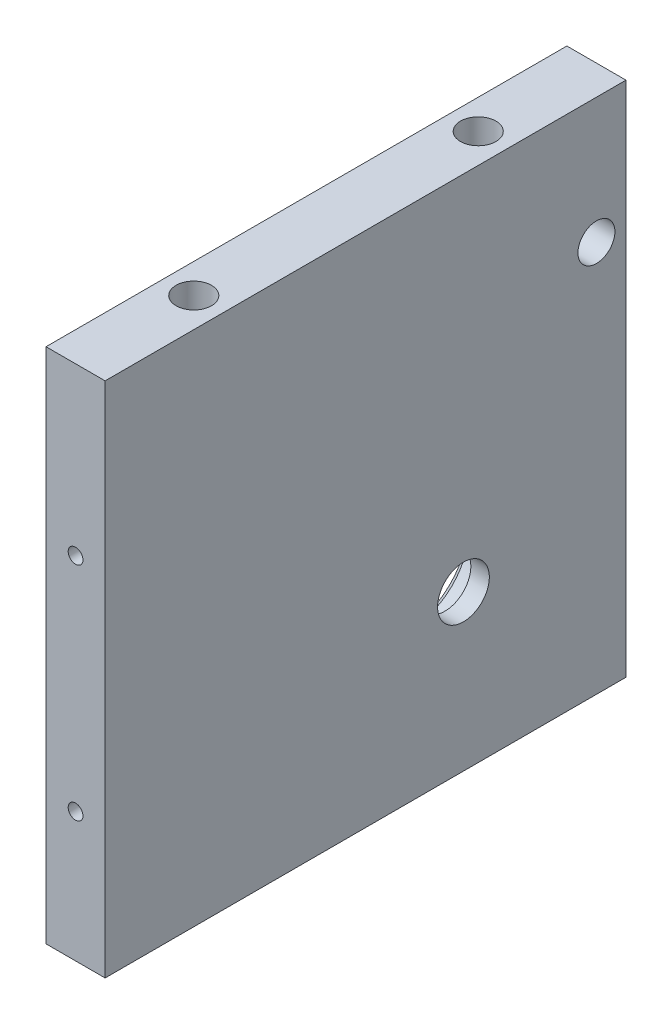
ISO-10303-21;
HEADER;
FILE_DESCRIPTION(('STEP AP214'),'2;1');
FILE_NAME('part.step','',(''),(''),'','','');
FILE_SCHEMA(('AUTOMOTIVE_DESIGN { 1 0 10303 214 1 1 1 1 }'));
ENDSEC;
DATA;
#1=APPLICATION_CONTEXT('core data for automotive mechanical design processes');
#2=APPLICATION_PROTOCOL_DEFINITION('international standard','automotive_design',2000,#1);
#3=PRODUCT_CONTEXT('',#1,'mechanical');
#4=PRODUCT('Part','Part','',(#3));
#5=PRODUCT_RELATED_PRODUCT_CATEGORY('part','',(#4));
#6=PRODUCT_DEFINITION_FORMATION('','',#4);
#7=PRODUCT_DEFINITION_CONTEXT('part definition',#1,'design');
#8=PRODUCT_DEFINITION('design','',#6,#7);
#9=PRODUCT_DEFINITION_SHAPE('','',#8);
#10=(LENGTH_UNIT() NAMED_UNIT(*) SI_UNIT(.MILLI.,.METRE.));
#11=(NAMED_UNIT(*) PLANE_ANGLE_UNIT() SI_UNIT($,.RADIAN.));
#12=(NAMED_UNIT(*) SI_UNIT($,.STERADIAN.) SOLID_ANGLE_UNIT());
#13=UNCERTAINTY_MEASURE_WITH_UNIT(LENGTH_MEASURE(1.E-05),#10,'distance_accuracy_value','');
#14=(GEOMETRIC_REPRESENTATION_CONTEXT(3) GLOBAL_UNCERTAINTY_ASSIGNED_CONTEXT((#13)) GLOBAL_UNIT_ASSIGNED_CONTEXT((#10,
#11,#12)) REPRESENTATION_CONTEXT('',''));
#15=CARTESIAN_POINT('',(0.,0.,0.));
#16=DIRECTION('',(0.,0.,1.));
#17=DIRECTION('',(1.,0.,0.));
#18=AXIS2_PLACEMENT_3D('',#15,#16,#17);
#19=CARTESIAN_POINT('',(42.5,0.,-35.25));
#20=DIRECTION('',(0.,1.,0.));
#21=DIRECTION('',(0.,0.,1.));
#22=AXIS2_PLACEMENT_3D('',#19,#20,#21);
#23=PLANE('',#22);
#24=CARTESIAN_POINT('',(46.5,0.,25.25));
#25=DIRECTION('',(0.,-1.,0.));
#26=DIRECTION('',(0.,0.,-1.));
#27=AXIS2_PLACEMENT_3D('',#24,#25,#26);
#28=CIRCLE('',#27,2.4);
#29=CARTESIAN_POINT('',(46.5,0.,22.85));
#30=VERTEX_POINT('',#29);
#31=EDGE_CURVE('E140',#30,#30,#28,.T.);
#32=ORIENTED_EDGE('',*,*,#31,.F.);
#33=EDGE_LOOP('',(#32));
#34=FACE_BOUND('',#33,.T.);
#35=CARTESIAN_POINT('',(46.5,0.,-25.25));
#36=DIRECTION('',(0.,-1.,0.));
#37=DIRECTION('',(0.,0.,-1.));
#38=AXIS2_PLACEMENT_3D('',#35,#36,#37);
#39=CIRCLE('',#38,2.4);
#40=CARTESIAN_POINT('',(46.5,0.,-27.65));
#41=VERTEX_POINT('',#40);
#42=EDGE_CURVE('E146',#41,#41,#39,.T.);
#43=ORIENTED_EDGE('',*,*,#42,.F.);
#44=EDGE_LOOP('',(#43));
#45=FACE_BOUND('',#44,.T.);
#46=DIRECTION('',(-1.,0.,0.));
#47=VECTOR('',#46,1.);
#48=CARTESIAN_POINT('',(42.5,0.,35.25));
#49=LINE('',#48,#47);
#50=CARTESIAN_POINT('',(50.5,0.,35.2500000000191));
#51=VERTEX_POINT('',#50);
#52=CARTESIAN_POINT('',(42.5,0.,35.25));
#53=VERTEX_POINT('',#52);
#54=EDGE_CURVE('E43',#51,#53,#49,.T.);
#55=ORIENTED_EDGE('',*,*,#54,.T.);
#56=DIRECTION('',(0.,0.,-1.));
#57=VECTOR('',#56,1.);
#58=CARTESIAN_POINT('',(42.5,0.,35.25));
#59=LINE('',#58,#57);
#60=CARTESIAN_POINT('',(42.5,0.,-35.25));
#61=VERTEX_POINT('',#60);
#62=EDGE_CURVE('E57',#53,#61,#59,.T.);
#63=ORIENTED_EDGE('',*,*,#62,.T.);
#64=DIRECTION('',(-1.,0.,0.));
#65=VECTOR('',#64,1.);
#66=CARTESIAN_POINT('',(19.7,0.,-35.25));
#67=LINE('',#66,#65);
#68=CARTESIAN_POINT('',(50.5,0.,-35.25));
#69=VERTEX_POINT('',#68);
#70=EDGE_CURVE('E155',#69,#61,#67,.T.);
#71=ORIENTED_EDGE('',*,*,#70,.F.);
#72=DIRECTION('',(0.,0.,-1.));
#73=VECTOR('',#72,1.);
#74=CARTESIAN_POINT('',(50.5,0.,35.25));
#75=LINE('',#74,#73);
#76=EDGE_CURVE('E159',#51,#69,#75,.T.);
#77=ORIENTED_EDGE('',*,*,#76,.F.);
#78=EDGE_LOOP('',(#55,#63,#71,#77));
#79=FACE_BOUND('',#78,.T.);
#80=ADVANCED_FACE('F39',(#34,#45,#79),#23,.F.);
#81=CARTESIAN_POINT('',(-42.5,0.,35.25));
#82=DIRECTION('',(0.,0.,-1.));
#83=DIRECTION('',(-1.,0.,0.));
#84=AXIS2_PLACEMENT_3D('',#81,#82,#83);
#85=PLANE('',#84);
#86=CARTESIAN_POINT('',(46.5,17.5,35.25));
#87=DIRECTION('',(0.,0.,-1.));
#88=DIRECTION('',(-1.,0.,0.));
#89=AXIS2_PLACEMENT_3D('',#86,#87,#88);
#90=CIRCLE('',#89,0.999999999999998);
#91=CARTESIAN_POINT('',(45.5,17.5,35.25));
#92=VERTEX_POINT('',#91);
#93=EDGE_CURVE('E85',#92,#92,#90,.T.);
#94=ORIENTED_EDGE('',*,*,#93,.T.);
#95=EDGE_LOOP('',(#94));
#96=FACE_BOUND('',#95,.T.);
#97=CARTESIAN_POINT('',(46.5,47.5,35.25));
#98=DIRECTION('',(0.,0.,-1.));
#99=DIRECTION('',(-1.,0.,0.));
#100=AXIS2_PLACEMENT_3D('',#97,#98,#99);
#101=CIRCLE('',#100,0.999999999999998);
#102=CARTESIAN_POINT('',(45.5,47.5,35.25));
#103=VERTEX_POINT('',#102);
#104=EDGE_CURVE('E95',#103,#103,#101,.T.);
#105=ORIENTED_EDGE('',*,*,#104,.T.);
#106=EDGE_LOOP('',(#105));
#107=FACE_BOUND('',#106,.T.);
#108=DIRECTION('',(1.,0.,0.));
#109=VECTOR('',#108,1.);
#110=CARTESIAN_POINT('',(0.,70.,35.25));
#111=LINE('',#110,#109);
#112=CARTESIAN_POINT('',(42.5,70.,35.25));
#113=VERTEX_POINT('',#112);
#114=CARTESIAN_POINT('',(50.5,70.,35.25));
#115=VERTEX_POINT('',#114);
#116=EDGE_CURVE('E88',#113,#115,#111,.T.);
#117=ORIENTED_EDGE('',*,*,#116,.F.);
#118=DIRECTION('',(0.,-1.,0.));
#119=VECTOR('',#118,1.);
#120=CARTESIAN_POINT('',(42.5,70.,35.25));
#121=LINE('',#120,#119);
#122=EDGE_CURVE('E78',#113,#53,#121,.T.);
#123=ORIENTED_EDGE('',*,*,#122,.T.);
#124=ORIENTED_EDGE('',*,*,#54,.F.);
#125=DIRECTION('',(0.,-1.,0.));
#126=VECTOR('',#125,1.);
#127=CARTESIAN_POINT('',(50.5,70.,35.25));
#128=LINE('',#127,#126);
#129=EDGE_CURVE('E90',#115,#51,#128,.T.);
#130=ORIENTED_EDGE('',*,*,#129,.F.);
#131=EDGE_LOOP('',(#117,#123,#124,#130));
#132=FACE_BOUND('',#131,.T.);
#133=ADVANCED_FACE('F41',(#96,#107,#132),#85,.F.);
#134=CARTESIAN_POINT('',(19.7,6.8,-35.25));
#135=DIRECTION('',(0.,0.,1.));
#136=DIRECTION('',(1.,0.,0.));
#137=AXIS2_PLACEMENT_3D('',#134,#135,#136);
#138=PLANE('',#137);
#139=CARTESIAN_POINT('',(46.5,17.5,-35.25));
#140=DIRECTION('',(0.,0.,1.));
#141=DIRECTION('',(1.,0.,0.));
#142=AXIS2_PLACEMENT_3D('',#139,#140,#141);
#143=CIRCLE('',#142,0.999999999999998);
#144=CARTESIAN_POINT('',(47.5,17.5,-35.25));
#145=VERTEX_POINT('',#144);
#146=EDGE_CURVE('E172',#145,#145,#143,.F.);
#147=ORIENTED_EDGE('',*,*,#146,.F.);
#148=EDGE_LOOP('',(#147));
#149=FACE_BOUND('',#148,.T.);
#150=CARTESIAN_POINT('',(46.5,47.5,-35.25));
#151=DIRECTION('',(0.,0.,1.));
#152=DIRECTION('',(1.,0.,0.));
#153=AXIS2_PLACEMENT_3D('',#150,#151,#152);
#154=CIRCLE('',#153,0.999999999999998);
#155=CARTESIAN_POINT('',(47.5,47.5,-35.25));
#156=VERTEX_POINT('',#155);
#157=EDGE_CURVE('E168',#156,#156,#154,.F.);
#158=ORIENTED_EDGE('',*,*,#157,.F.);
#159=EDGE_LOOP('',(#158));
#160=FACE_BOUND('',#159,.T.);
#161=DIRECTION('',(0.,1.,0.));
#162=VECTOR('',#161,1.);
#163=CARTESIAN_POINT('',(50.5,70.,-35.25));
#164=LINE('',#163,#162);
#165=CARTESIAN_POINT('',(50.5,70.,-35.25));
#166=VERTEX_POINT('',#165);
#167=EDGE_CURVE('E162',#69,#166,#164,.T.);
#168=ORIENTED_EDGE('',*,*,#167,.F.);
#169=ORIENTED_EDGE('',*,*,#70,.T.);
#170=DIRECTION('',(0.,-1.,0.));
#171=VECTOR('',#170,1.);
#172=CARTESIAN_POINT('',(42.5,70.,-35.25));
#173=LINE('',#172,#171);
#174=CARTESIAN_POINT('',(42.5,70.,-35.25));
#175=VERTEX_POINT('',#174);
#176=EDGE_CURVE('E101',#175,#61,#173,.T.);
#177=ORIENTED_EDGE('',*,*,#176,.F.);
#178=DIRECTION('',(-1.,0.,0.));
#179=VECTOR('',#178,1.);
#180=CARTESIAN_POINT('',(0.,70.,-35.25));
#181=LINE('',#180,#179);
#182=EDGE_CURVE('E94',#166,#175,#181,.T.);
#183=ORIENTED_EDGE('',*,*,#182,.F.);
#184=EDGE_LOOP('',(#168,#169,#177,#183));
#185=FACE_BOUND('',#184,.T.);
#186=ADVANCED_FACE('F209',(#149,#160,#185),#138,.F.);
#187=CARTESIAN_POINT('',(0.,5.5,0.));
#188=DIRECTION('',(0.,-1.,0.));
#189=DIRECTION('',(0.,0.,-1.));
#190=AXIS2_PLACEMENT_3D('',#187,#188,#189);
#191=PLANE('',#190);
#192=CARTESIAN_POINT('',(46.5,5.5,25.25));
#193=DIRECTION('',(0.,-1.,0.));
#194=DIRECTION('',(0.,0.,-1.));
#195=AXIS2_PLACEMENT_3D('',#192,#193,#194);
#196=CIRCLE('',#195,2.4);
#197=CARTESIAN_POINT('',(46.5,5.5,22.85));
#198=VERTEX_POINT('',#197);
#199=EDGE_CURVE('E137',#198,#198,#196,.F.);
#200=ORIENTED_EDGE('',*,*,#199,.F.);
#201=EDGE_LOOP('',(#200));
#202=FACE_BOUND('',#201,.T.);
#203=ADVANCED_FACE('F216',(#202),#191,.T.);
#204=CARTESIAN_POINT('',(46.5,17.7882250993909,25.25));
#205=DIRECTION('',(0.,-1.,0.));
#206=DIRECTION('',(0.,0.,-1.));
#207=AXIS2_PLACEMENT_3D('',#204,#205,#206);
#208=CYLINDRICAL_SURFACE('',#207,2.4);
#209=ORIENTED_EDGE('',*,*,#199,.T.);
#210=EDGE_LOOP('',(#209));
#211=FACE_BOUND('',#210,.T.);
#212=ORIENTED_EDGE('',*,*,#31,.T.);
#213=EDGE_LOOP('',(#212));
#214=FACE_BOUND('',#213,.T.);
#215=ADVANCED_FACE('F222',(#211,#214),#208,.F.);
#216=CARTESIAN_POINT('',(0.,5.5,0.));
#217=DIRECTION('',(0.,-1.,0.));
#218=DIRECTION('',(0.,0.,-1.));
#219=AXIS2_PLACEMENT_3D('',#216,#217,#218);
#220=PLANE('',#219);
#221=CARTESIAN_POINT('',(46.5,5.5,-25.25));
#222=DIRECTION('',(0.,-1.,0.));
#223=DIRECTION('',(0.,0.,-1.));
#224=AXIS2_PLACEMENT_3D('',#221,#222,#223);
#225=CIRCLE('',#224,2.4);
#226=CARTESIAN_POINT('',(46.5,5.5,-27.65));
#227=VERTEX_POINT('',#226);
#228=EDGE_CURVE('E143',#227,#227,#225,.F.);
#229=ORIENTED_EDGE('',*,*,#228,.F.);
#230=EDGE_LOOP('',(#229));
#231=FACE_BOUND('',#230,.T.);
#232=ADVANCED_FACE('F239',(#231),#220,.T.);
#233=CARTESIAN_POINT('',(46.5,17.7882250993909,-25.25));
#234=DIRECTION('',(0.,-1.,0.));
#235=DIRECTION('',(0.,0.,-1.));
#236=AXIS2_PLACEMENT_3D('',#233,#234,#235);
#237=CYLINDRICAL_SURFACE('',#236,2.4);
#238=ORIENTED_EDGE('',*,*,#228,.T.);
#239=EDGE_LOOP('',(#238));
#240=FACE_BOUND('',#239,.T.);
#241=ORIENTED_EDGE('',*,*,#42,.T.);
#242=EDGE_LOOP('',(#241));
#243=FACE_BOUND('',#242,.T.);
#244=ADVANCED_FACE('F225',(#240,#243),#237,.F.);
#245=CARTESIAN_POINT('',(46.5,17.5,23.25));
#246=DIRECTION('',(0.,0.,-1.));
#247=DIRECTION('',(1.,0.,0.));
#248=AXIS2_PLACEMENT_3D('',#245,#246,#247);
#249=PLANE('',#248);
#250=CARTESIAN_POINT('',(46.5,17.5,23.25));
#251=DIRECTION('',(0.,0.,-1.));
#252=DIRECTION('',(1.,0.,0.));
#253=AXIS2_PLACEMENT_3D('',#250,#251,#252);
#254=CIRCLE('',#253,0.999999999999998);
#255=CARTESIAN_POINT('',(47.5,17.5,23.25));
#256=VERTEX_POINT('',#255);
#257=EDGE_CURVE('E134',#256,#256,#254,.T.);
#258=ORIENTED_EDGE('',*,*,#257,.F.);
#259=EDGE_LOOP('',(#258));
#260=FACE_BOUND('',#259,.T.);
#261=ADVANCED_FACE('F244',(#260),#249,.F.);
#262=CARTESIAN_POINT('',(46.5,17.5,23.25));
#263=DIRECTION('',(0.,0.,1.));
#264=DIRECTION('',(1.,0.,0.));
#265=AXIS2_PLACEMENT_3D('',#262,#263,#264);
#266=CYLINDRICAL_SURFACE('',#265,0.999999999999998);
#267=ORIENTED_EDGE('',*,*,#93,.F.);
#268=EDGE_LOOP('',(#267));
#269=FACE_BOUND('',#268,.T.);
#270=ORIENTED_EDGE('',*,*,#257,.T.);
#271=EDGE_LOOP('',(#270));
#272=FACE_BOUND('',#271,.T.);
#273=ADVANCED_FACE('F253',(#269,#272),#266,.F.);
#274=CARTESIAN_POINT('',(46.5,47.5,23.25));
#275=DIRECTION('',(0.,0.,1.));
#276=DIRECTION('',(-1.,0.,0.));
#277=AXIS2_PLACEMENT_3D('',#274,#275,#276);
#278=PLANE('',#277);
#279=CARTESIAN_POINT('',(46.5,47.5,23.25));
#280=DIRECTION('',(0.,0.,-1.));
#281=DIRECTION('',(-1.,0.,0.));
#282=AXIS2_PLACEMENT_3D('',#279,#280,#281);
#283=CIRCLE('',#282,0.999999999999998);
#284=CARTESIAN_POINT('',(45.5,47.5,23.25));
#285=VERTEX_POINT('',#284);
#286=EDGE_CURVE('E131',#285,#285,#283,.T.);
#287=ORIENTED_EDGE('',*,*,#286,.F.);
#288=EDGE_LOOP('',(#287));
#289=FACE_BOUND('',#288,.T.);
#290=ADVANCED_FACE('F258',(#289),#278,.T.);
#291=CARTESIAN_POINT('',(46.5,47.5,23.25));
#292=DIRECTION('',(0.,0.,1.));
#293=DIRECTION('',(1.,0.,0.));
#294=AXIS2_PLACEMENT_3D('',#291,#292,#293);
#295=CYLINDRICAL_SURFACE('',#294,0.999999999999998);
#296=ORIENTED_EDGE('',*,*,#104,.F.);
#297=EDGE_LOOP('',(#296));
#298=FACE_BOUND('',#297,.T.);
#299=ORIENTED_EDGE('',*,*,#286,.T.);
#300=EDGE_LOOP('',(#299));
#301=FACE_BOUND('',#300,.T.);
#302=ADVANCED_FACE('F262',(#298,#301),#295,.F.);
#303=CARTESIAN_POINT('',(46.5,17.5,-23.25));
#304=DIRECTION('',(0.,0.,1.));
#305=DIRECTION('',(1.,0.,0.));
#306=AXIS2_PLACEMENT_3D('',#303,#304,#305);
#307=PLANE('',#306);
#308=CARTESIAN_POINT('',(46.5,17.5,-23.25));
#309=DIRECTION('',(0.,0.,-1.));
#310=DIRECTION('',(1.,0.,0.));
#311=AXIS2_PLACEMENT_3D('',#308,#309,#310);
#312=CIRCLE('',#311,0.999999999999998);
#313=CARTESIAN_POINT('',(47.5,17.5,-23.25));
#314=VERTEX_POINT('',#313);
#315=EDGE_CURVE('E128',#314,#314,#312,.T.);
#316=ORIENTED_EDGE('',*,*,#315,.T.);
#317=EDGE_LOOP('',(#316));
#318=FACE_BOUND('',#317,.T.);
#319=ADVANCED_FACE('F250',(#318),#307,.F.);
#320=CARTESIAN_POINT('',(46.5,17.5,-23.25));
#321=DIRECTION('',(0.,0.,-1.));
#322=DIRECTION('',(-1.,0.,0.));
#323=AXIS2_PLACEMENT_3D('',#320,#321,#322);
#324=CYLINDRICAL_SURFACE('',#323,0.999999999999998);
#325=ORIENTED_EDGE('',*,*,#146,.T.);
#326=EDGE_LOOP('',(#325));
#327=FACE_BOUND('',#326,.T.);
#328=ORIENTED_EDGE('',*,*,#315,.F.);
#329=EDGE_LOOP('',(#328));
#330=FACE_BOUND('',#329,.T.);
#331=ADVANCED_FACE('F269',(#327,#330),#324,.F.);
#332=CARTESIAN_POINT('',(46.5,47.5,-23.25));
#333=DIRECTION('',(0.,0.,-1.));
#334=DIRECTION('',(-1.,0.,0.));
#335=AXIS2_PLACEMENT_3D('',#332,#333,#334);
#336=PLANE('',#335);
#337=CARTESIAN_POINT('',(46.5,47.5,-23.25));
#338=DIRECTION('',(0.,0.,-1.));
#339=DIRECTION('',(-1.,0.,0.));
#340=AXIS2_PLACEMENT_3D('',#337,#338,#339);
#341=CIRCLE('',#340,0.999999999999998);
#342=CARTESIAN_POINT('',(45.5,47.5,-23.25));
#343=VERTEX_POINT('',#342);
#344=EDGE_CURVE('E123',#343,#343,#341,.T.);
#345=ORIENTED_EDGE('',*,*,#344,.T.);
#346=EDGE_LOOP('',(#345));
#347=FACE_BOUND('',#346,.T.);
#348=ADVANCED_FACE('F273',(#347),#336,.T.);
#349=CARTESIAN_POINT('',(46.5,47.5,-23.25));
#350=DIRECTION('',(0.,0.,-1.));
#351=DIRECTION('',(-1.,0.,0.));
#352=AXIS2_PLACEMENT_3D('',#349,#350,#351);
#353=CYLINDRICAL_SURFACE('',#352,0.999999999999998);
#354=ORIENTED_EDGE('',*,*,#157,.T.);
#355=EDGE_LOOP('',(#354));
#356=FACE_BOUND('',#355,.T.);
#357=ORIENTED_EDGE('',*,*,#344,.F.);
#358=EDGE_LOOP('',(#357));
#359=FACE_BOUND('',#358,.T.);
#360=ADVANCED_FACE('F255',(#356,#359),#353,.F.);
#361=CARTESIAN_POINT('',(50.500012,21.,-13.25));
#362=DIRECTION('',(-1.,0.,0.));
#363=DIRECTION('',(0.,0.,1.));
#364=AXIS2_PLACEMENT_3D('',#361,#362,#363);
#365=CYLINDRICAL_SURFACE('',#364,3.5);
#366=CARTESIAN_POINT('',(50.5,21.,-13.25));
#367=DIRECTION('',(-1.,0.,0.));
#368=DIRECTION('',(0.,0.,1.));
#369=AXIS2_PLACEMENT_3D('',#366,#367,#368);
#370=CIRCLE('',#369,3.5);
#371=CARTESIAN_POINT('',(50.5,21.,-9.75));
#372=VERTEX_POINT('',#371);
#373=EDGE_CURVE('E100',#372,#372,#370,.F.);
#374=CARTESIAN_POINT('',(48.,21.,-13.25));
#375=DIRECTION('',(-1.,0.,0.));
#376=DIRECTION('',(0.,0.,1.));
#377=AXIS2_PLACEMENT_3D('',#374,#375,#376);
#378=CIRCLE('',#377,3.5);
#379=CARTESIAN_POINT('',(48.,21.,-9.75));
#380=VERTEX_POINT('',#379);
#381=EDGE_CURVE('E104',#380,#380,#378,.T.);
#382=CARTESIAN_POINT('',(50.5,21.,-9.75));
#383=CARTESIAN_POINT('',(50.4739583333333,21.,-9.75));
#384=CARTESIAN_POINT('',(50.4479166666667,21.,-9.75));
#385=CARTESIAN_POINT('',(50.3958333333333,21.,-9.75));
#386=CARTESIAN_POINT('',(50.3697916666667,21.,-9.75));
#387=CARTESIAN_POINT('',(50.3177083333333,21.,-9.75));
#388=CARTESIAN_POINT('',(50.2916666666667,21.,-9.75));
#389=CARTESIAN_POINT('',(50.2395833333333,21.,-9.75));
#390=CARTESIAN_POINT('',(50.2135416666667,21.,-9.75));
#391=CARTESIAN_POINT('',(50.1614583333333,21.,-9.75));
#392=CARTESIAN_POINT('',(50.1354166666667,21.,-9.75));
#393=CARTESIAN_POINT('',(50.0833333333333,21.,-9.75));
#394=CARTESIAN_POINT('',(50.0572916666667,21.,-9.75));
#395=CARTESIAN_POINT('',(50.0052083333333,21.,-9.75));
#396=CARTESIAN_POINT('',(49.9791666666667,21.,-9.75));
#397=CARTESIAN_POINT('',(49.9270833333333,21.,-9.75));
#398=CARTESIAN_POINT('',(49.9010416666667,21.,-9.75));
#399=CARTESIAN_POINT('',(49.8489583333333,21.,-9.75));
#400=CARTESIAN_POINT('',(49.8229166666667,21.,-9.75));
#401=CARTESIAN_POINT('',(49.7708333333333,21.,-9.75));
#402=CARTESIAN_POINT('',(49.7447916666667,21.,-9.75));
#403=CARTESIAN_POINT('',(49.6927083333333,21.,-9.75));
#404=CARTESIAN_POINT('',(49.6666666666667,21.,-9.75));
#405=CARTESIAN_POINT('',(49.6145833333333,21.,-9.75));
#406=CARTESIAN_POINT('',(49.5885416666667,21.,-9.75));
#407=CARTESIAN_POINT('',(49.5364583333333,21.,-9.75));
#408=CARTESIAN_POINT('',(49.5104166666667,21.,-9.75));
#409=CARTESIAN_POINT('',(49.4583333333333,21.,-9.75));
#410=CARTESIAN_POINT('',(49.4322916666667,21.,-9.75));
#411=CARTESIAN_POINT('',(49.3802083333333,21.,-9.75));
#412=CARTESIAN_POINT('',(49.3541666666667,21.,-9.75));
#413=CARTESIAN_POINT('',(49.3020833333333,21.,-9.75));
#414=CARTESIAN_POINT('',(49.2760416666667,21.,-9.75));
#415=CARTESIAN_POINT('',(49.2239583333333,21.,-9.75));
#416=CARTESIAN_POINT('',(49.1979166666667,21.,-9.75));
#417=CARTESIAN_POINT('',(49.1458333333333,21.,-9.75));
#418=CARTESIAN_POINT('',(49.1197916666667,21.,-9.75));
#419=CARTESIAN_POINT('',(49.0677083333333,21.,-9.75));
#420=CARTESIAN_POINT('',(49.0416666666667,21.,-9.75));
#421=CARTESIAN_POINT('',(48.9895833333333,21.,-9.75));
#422=CARTESIAN_POINT('',(48.9635416666667,21.,-9.75));
#423=CARTESIAN_POINT('',(48.9114583333333,21.,-9.75));
#424=CARTESIAN_POINT('',(48.8854166666667,21.,-9.75));
#425=CARTESIAN_POINT('',(48.8333333333333,21.,-9.75));
#426=CARTESIAN_POINT('',(48.8072916666667,21.,-9.75));
#427=CARTESIAN_POINT('',(48.7552083333333,21.,-9.75));
#428=CARTESIAN_POINT('',(48.7291666666667,21.,-9.75));
#429=CARTESIAN_POINT('',(48.6770833333333,21.,-9.75));
#430=CARTESIAN_POINT('',(48.6510416666667,21.,-9.75));
#431=CARTESIAN_POINT('',(48.5989583333333,21.,-9.75));
#432=CARTESIAN_POINT('',(48.5729166666667,21.,-9.75));
#433=CARTESIAN_POINT('',(48.5208333333333,21.,-9.75));
#434=CARTESIAN_POINT('',(48.4947916666667,21.,-9.75));
#435=CARTESIAN_POINT('',(48.4427083333333,21.,-9.75));
#436=CARTESIAN_POINT('',(48.4166666666667,21.,-9.75));
#437=CARTESIAN_POINT('',(48.3645833333333,21.,-9.75));
#438=CARTESIAN_POINT('',(48.3385416666667,21.,-9.75));
#439=CARTESIAN_POINT('',(48.2864583333333,21.,-9.75));
#440=CARTESIAN_POINT('',(48.2604166666667,21.,-9.75));
#441=CARTESIAN_POINT('',(48.2083333333333,21.,-9.75));
#442=CARTESIAN_POINT('',(48.1822916666667,21.,-9.75));
#443=CARTESIAN_POINT('',(48.1302083333333,21.,-9.75));
#444=CARTESIAN_POINT('',(48.1041666666667,21.,-9.75));
#445=CARTESIAN_POINT('',(48.0520833333333,21.,-9.75));
#446=CARTESIAN_POINT('',(48.0260416666667,21.,-9.75));
#447=CARTESIAN_POINT('',(48.,21.,-9.75));
#448=B_SPLINE_CURVE_WITH_KNOTS('',3,(#382,#383,#384,#385,#386,#387,#388,#389,#390,#391,#392,
#393,#394,#395,#396,#397,#398,#399,#400,#401,#402,#403,#404,#405,#406,#407,#408,#409,#410,#411,
#412,#413,#414,#415,#416,#417,#418,#419,#420,#421,#422,#423,#424,#425,#426,#427,#428,#429,#430,
#431,#432,#433,#434,#435,#436,#437,#438,#439,#440,#441,#442,#443,#444,#445,#446,#447),
.UNSPECIFIED.,.F.,.F.,(4,2,2,2,2,2,2,2,2,2,2,2,2,2,2,2,2,2,2,2,2,2,2,2,2,2,2,2,2,2,2,2,4),(0.,
0.0781249999999983,0.156249999999997,0.234374999999995,0.3125,0.390624999999999,
0.468749999999997,0.546874999999995,0.625000000000001,0.703124999999999,0.781249999999997,
0.859374999999996,0.937500000000001,1.015625,1.09375,1.171875,1.25,1.328125,1.40625,1.484375,
1.5625,1.640625,1.71875,1.796875,1.875,1.953125,2.03125,2.109375,2.1875,2.265625,2.34375,
2.421875,2.5),.UNSPECIFIED.);
#449=EDGE_CURVE('BSEAM184',#372,#380,#448,.T.);
#450=ORIENTED_EDGE('',*,*,#373,.T.);
#451=ORIENTED_EDGE('',*,*,#381,.T.);
#452=ORIENTED_EDGE('',*,*,#449,.T.);
#453=ORIENTED_EDGE('',*,*,#449,.F.);
#454=EDGE_LOOP('',(#450,#452,#451,#453));
#455=FACE_BOUND('',#454,.T.);
#456=ADVANCED_FACE('F184',(#455),#365,.F.);
#457=CARTESIAN_POINT('',(0.,70.,0.));
#458=DIRECTION('',(0.,-1.,0.));
#459=DIRECTION('',(0.,0.,-1.));
#460=AXIS2_PLACEMENT_3D('',#457,#458,#459);
#461=PLANE('',#460);
#462=CARTESIAN_POINT('',(46.5,70.,-19.25));
#463=DIRECTION('',(0.,1.,0.));
#464=DIRECTION('',(0.,0.,-1.));
#465=AXIS2_PLACEMENT_3D('',#462,#463,#464);
#466=CIRCLE('',#465,2.4);
#467=CARTESIAN_POINT('',(46.5,70.,-21.65));
#468=VERTEX_POINT('',#467);
#469=EDGE_CURVE('E114',#468,#468,#466,.T.);
#470=ORIENTED_EDGE('',*,*,#469,.F.);
#471=EDGE_LOOP('',(#470));
#472=FACE_BOUND('',#471,.T.);
#473=CARTESIAN_POINT('',(46.5,70.,19.25));
#474=DIRECTION('',(0.,1.,0.));
#475=DIRECTION('',(0.,0.,1.));
#476=AXIS2_PLACEMENT_3D('',#473,#474,#475);
#477=CIRCLE('',#476,2.4);
#478=CARTESIAN_POINT('',(46.5,70.,21.65));
#479=VERTEX_POINT('',#478);
#480=EDGE_CURVE('E120',#479,#479,#477,.T.);
#481=ORIENTED_EDGE('',*,*,#480,.F.);
#482=EDGE_LOOP('',(#481));
#483=FACE_BOUND('',#482,.T.);
#484=DIRECTION('',(0.,0.,-1.));
#485=VECTOR('',#484,1.);
#486=CARTESIAN_POINT('',(42.5,70.,35.25));
#487=LINE('',#486,#485);
#488=EDGE_CURVE('E82',#113,#175,#487,.T.);
#489=ORIENTED_EDGE('',*,*,#488,.F.);
#490=ORIENTED_EDGE('',*,*,#116,.T.);
#491=DIRECTION('',(0.,0.,-1.));
#492=VECTOR('',#491,1.);
#493=CARTESIAN_POINT('',(50.5,70.,0.));
#494=LINE('',#493,#492);
#495=EDGE_CURVE('E106',#115,#166,#494,.T.);
#496=ORIENTED_EDGE('',*,*,#495,.T.);
#497=ORIENTED_EDGE('',*,*,#182,.T.);
#498=EDGE_LOOP('',(#489,#490,#496,#497));
#499=FACE_BOUND('',#498,.T.);
#500=ADVANCED_FACE('F98',(#472,#483,#499),#461,.F.);
#501=CARTESIAN_POINT('',(50.5,70.,35.25));
#502=DIRECTION('',(-1.,0.,0.));
#503=DIRECTION('',(0.,0.,1.));
#504=AXIS2_PLACEMENT_3D('',#501,#502,#503);
#505=PLANE('',#504);
#506=CARTESIAN_POINT('',(50.5,53.,-31.25));
#507=DIRECTION('',(1.,0.,0.));
#508=DIRECTION('',(0.,0.,-1.));
#509=AXIS2_PLACEMENT_3D('',#506,#507,#508);
#510=CIRCLE('',#509,2.49999999999998);
#511=CARTESIAN_POINT('',(50.5,53.,-33.75));
#512=VERTEX_POINT('',#511);
#513=EDGE_CURVE('E12',#512,#512,#510,.T.);
#514=ORIENTED_EDGE('',*,*,#513,.F.);
#515=EDGE_LOOP('',(#514));
#516=FACE_BOUND('',#515,.T.);
#517=ORIENTED_EDGE('',*,*,#373,.F.);
#518=EDGE_LOOP('',(#517));
#519=FACE_BOUND('',#518,.T.);
#520=ORIENTED_EDGE('',*,*,#495,.F.);
#521=ORIENTED_EDGE('',*,*,#129,.T.);
#522=ORIENTED_EDGE('',*,*,#76,.T.);
#523=ORIENTED_EDGE('',*,*,#167,.T.);
#524=EDGE_LOOP('',(#520,#521,#522,#523));
#525=FACE_BOUND('',#524,.T.);
#526=ADVANCED_FACE('F164',(#516,#519,#525),#505,.F.);
#527=CARTESIAN_POINT('',(42.5,70.,35.25));
#528=DIRECTION('',(-1.,0.,0.));
#529=DIRECTION('',(0.,0.,1.));
#530=AXIS2_PLACEMENT_3D('',#527,#528,#529);
#531=PLANE('',#530);
#532=CARTESIAN_POINT('',(42.5,53.,-31.25));
#533=DIRECTION('',(-1.,0.,0.));
#534=DIRECTION('',(0.,0.,1.));
#535=AXIS2_PLACEMENT_3D('',#532,#533,#534);
#536=CIRCLE('',#535,2.49999999999998);
#537=CARTESIAN_POINT('',(42.5,53.,-28.75));
#538=VERTEX_POINT('',#537);
#539=EDGE_CURVE('E49',#538,#538,#536,.T.);
#540=ORIENTED_EDGE('',*,*,#539,.F.);
#541=EDGE_LOOP('',(#540));
#542=FACE_BOUND('',#541,.T.);
#543=CARTESIAN_POINT('',(42.5,21.,-13.25));
#544=DIRECTION('',(-1.,0.,0.));
#545=DIRECTION('',(0.,0.,1.));
#546=AXIS2_PLACEMENT_3D('',#543,#544,#545);
#547=CIRCLE('',#546,8.74999999999998);
#548=CARTESIAN_POINT('',(42.5,21.,-4.50000000000002));
#549=VERTEX_POINT('',#548);
#550=EDGE_CURVE('E175',#549,#549,#547,.F.);
#551=ORIENTED_EDGE('',*,*,#550,.T.);
#552=EDGE_LOOP('',(#551));
#553=FACE_BOUND('',#552,.T.);
#554=ORIENTED_EDGE('',*,*,#62,.F.);
#555=ORIENTED_EDGE('',*,*,#122,.F.);
#556=ORIENTED_EDGE('',*,*,#488,.T.);
#557=ORIENTED_EDGE('',*,*,#176,.T.);
#558=EDGE_LOOP('',(#554,#555,#556,#557));
#559=FACE_BOUND('',#558,.T.);
#560=ADVANCED_FACE('F80',(#542,#553,#559),#531,.T.);
#561=CARTESIAN_POINT('',(48.,21.,-13.25));
#562=DIRECTION('',(-1.,0.,0.));
#563=DIRECTION('',(0.,0.,1.));
#564=AXIS2_PLACEMENT_3D('',#561,#562,#563);
#565=CYLINDRICAL_SURFACE('',#564,7.75);
#566=CARTESIAN_POINT('',(43.5,21.,-13.25));
#567=DIRECTION('',(-1.,0.,0.));
#568=DIRECTION('',(0.,0.,1.));
#569=AXIS2_PLACEMENT_3D('',#566,#567,#568);
#570=CIRCLE('',#569,7.75);
#571=CARTESIAN_POINT('',(43.5,21.,-5.5));
#572=VERTEX_POINT('',#571);
#573=EDGE_CURVE('E149',#572,#572,#570,.T.);
#574=ORIENTED_EDGE('',*,*,#573,.T.);
#575=EDGE_LOOP('',(#574));
#576=FACE_BOUND('',#575,.T.);
#577=CARTESIAN_POINT('',(48.,21.,-13.25));
#578=DIRECTION('',(-1.,0.,0.));
#579=DIRECTION('',(0.,0.,1.));
#580=AXIS2_PLACEMENT_3D('',#577,#578,#579);
#581=CIRCLE('',#580,7.75);
#582=CARTESIAN_POINT('',(48.,21.,-5.5));
#583=VERTEX_POINT('',#582);
#584=EDGE_CURVE('E110',#583,#583,#581,.T.);
#585=ORIENTED_EDGE('',*,*,#584,.F.);
#586=EDGE_LOOP('',(#585));
#587=FACE_BOUND('',#586,.T.);
#588=ADVANCED_FACE('F190',(#576,#587),#565,.F.);
#589=CARTESIAN_POINT('',(48.,21.,-13.25));
#590=DIRECTION('',(-1.,0.,0.));
#591=DIRECTION('',(0.,0.,1.));
#592=AXIS2_PLACEMENT_3D('',#589,#590,#591);
#593=PLANE('',#592);
#594=ORIENTED_EDGE('',*,*,#381,.F.);
#595=EDGE_LOOP('',(#594));
#596=FACE_BOUND('',#595,.T.);
#597=ORIENTED_EDGE('',*,*,#584,.T.);
#598=EDGE_LOOP('',(#597));
#599=FACE_BOUND('',#598,.T.);
#600=ADVANCED_FACE('F186',(#596,#599),#593,.T.);
#601=CARTESIAN_POINT('',(43.5,21.,-13.25));
#602=DIRECTION('',(-1.,0.,0.));
#603=DIRECTION('',(0.,0.,1.));
#604=AXIS2_PLACEMENT_3D('',#601,#602,#603);
#605=CONICAL_SURFACE('',#604,7.75,0.785398163397455);
#606=ORIENTED_EDGE('',*,*,#550,.F.);
#607=EDGE_LOOP('',(#606));
#608=FACE_BOUND('',#607,.T.);
#609=ORIENTED_EDGE('',*,*,#573,.F.);
#610=EDGE_LOOP('',(#609));
#611=FACE_BOUND('',#610,.T.);
#612=ADVANCED_FACE('F189',(#608,#611),#605,.F.);
#613=CARTESIAN_POINT('',(46.5,64.5,19.25));
#614=DIRECTION('',(0.,1.,0.));
#615=DIRECTION('',(0.,0.,1.));
#616=AXIS2_PLACEMENT_3D('',#613,#614,#615);
#617=CYLINDRICAL_SURFACE('',#616,2.4);
#618=CARTESIAN_POINT('',(46.5,64.5,19.25));
#619=DIRECTION('',(0.,1.,0.));
#620=DIRECTION('',(0.,0.,1.));
#621=AXIS2_PLACEMENT_3D('',#618,#619,#620);
#622=CIRCLE('',#621,2.4);
#623=CARTESIAN_POINT('',(46.5,64.5,21.65));
#624=VERTEX_POINT('',#623);
#625=EDGE_CURVE('E117',#624,#624,#622,.T.);
#626=ORIENTED_EDGE('',*,*,#625,.F.);
#627=EDGE_LOOP('',(#626));
#628=FACE_BOUND('',#627,.T.);
#629=ORIENTED_EDGE('',*,*,#480,.T.);
#630=EDGE_LOOP('',(#629));
#631=FACE_BOUND('',#630,.T.);
#632=ADVANCED_FACE('F284',(#628,#631),#617,.F.);
#633=CARTESIAN_POINT('',(46.5,64.5,19.25));
#634=DIRECTION('',(0.,1.,0.));
#635=DIRECTION('',(0.,0.,1.));
#636=AXIS2_PLACEMENT_3D('',#633,#634,#635);
#637=PLANE('',#636);
#638=ORIENTED_EDGE('',*,*,#625,.T.);
#639=EDGE_LOOP('',(#638));
#640=FACE_BOUND('',#639,.T.);
#641=ADVANCED_FACE('F281',(#640),#637,.T.);
#642=CARTESIAN_POINT('',(46.5,64.5,-19.25));
#643=DIRECTION('',(0.,1.,0.));
#644=DIRECTION('',(0.,0.,1.));
#645=AXIS2_PLACEMENT_3D('',#642,#643,#644);
#646=CYLINDRICAL_SURFACE('',#645,2.4);
#647=CARTESIAN_POINT('',(46.5,64.5,-19.25));
#648=DIRECTION('',(0.,1.,0.));
#649=DIRECTION('',(0.,0.,-1.));
#650=AXIS2_PLACEMENT_3D('',#647,#648,#649);
#651=CIRCLE('',#650,2.4);
#652=CARTESIAN_POINT('',(46.5,64.5,-21.65));
#653=VERTEX_POINT('',#652);
#654=EDGE_CURVE('E113',#653,#653,#651,.T.);
#655=ORIENTED_EDGE('',*,*,#654,.F.);
#656=EDGE_LOOP('',(#655));
#657=FACE_BOUND('',#656,.T.);
#658=ORIENTED_EDGE('',*,*,#469,.T.);
#659=EDGE_LOOP('',(#658));
#660=FACE_BOUND('',#659,.T.);
#661=ADVANCED_FACE('F234',(#657,#660),#646,.F.);
#662=CARTESIAN_POINT('',(46.5,64.5,-19.25));
#663=DIRECTION('',(0.,-1.,0.));
#664=DIRECTION('',(0.,0.,-1.));
#665=AXIS2_PLACEMENT_3D('',#662,#663,#664);
#666=PLANE('',#665);
#667=ORIENTED_EDGE('',*,*,#654,.T.);
#668=EDGE_LOOP('',(#667));
#669=FACE_BOUND('',#668,.T.);
#670=ADVANCED_FACE('F229',(#669),#666,.F.);
#671=CARTESIAN_POINT('',(-50.5,53.,-31.25));
#672=DIRECTION('',(1.,0.,0.));
#673=DIRECTION('',(0.,0.,-1.));
#674=AXIS2_PLACEMENT_3D('',#671,#672,#673);
#675=CYLINDRICAL_SURFACE('',#674,2.49999999999998);
#676=ORIENTED_EDGE('',*,*,#539,.T.);
#677=EDGE_LOOP('',(#676));
#678=FACE_BOUND('',#677,.T.);
#679=ORIENTED_EDGE('',*,*,#513,.T.);
#680=EDGE_LOOP('',(#679));
#681=FACE_BOUND('',#680,.T.);
#682=ADVANCED_FACE('F218',(#678,#681),#675,.F.);
#683=CLOSED_SHELL('',(#80,#133,#186,#203,#215,#232,#244,#261,#273,#290,#302,#319,#331,#348,#360,
#456,#500,#526,#560,#588,#600,#612,#632,#641,#661,#670,#682));
#684=MANIFOLD_SOLID_BREP('B2',#683);
#685=ADVANCED_BREP_SHAPE_REPRESENTATION('',(#18,#684),#14);
#686=SHAPE_DEFINITION_REPRESENTATION(#9,#685);
ENDSEC;
END-ISO-10303-21;
